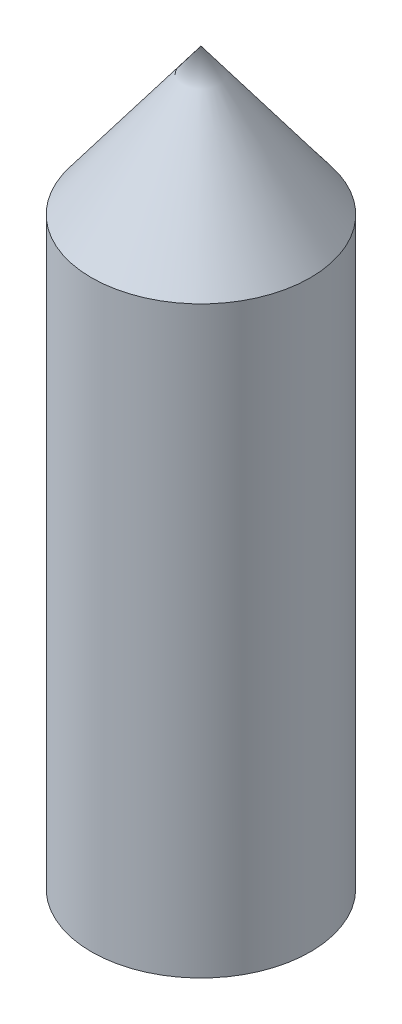
ISO-10303-21;
HEADER;
FILE_DESCRIPTION(('STEP AP214'),'2;1');
FILE_NAME('part.step','',(''),(''),'','','');
FILE_SCHEMA(('AUTOMOTIVE_DESIGN { 1 0 10303 214 1 1 1 1 }'));
ENDSEC;
DATA;
#1=APPLICATION_CONTEXT('core data for automotive mechanical design processes');
#2=APPLICATION_PROTOCOL_DEFINITION('international standard','automotive_design',2000,#1);
#3=PRODUCT_CONTEXT('',#1,'mechanical');
#4=PRODUCT('Part','Part','',(#3));
#5=PRODUCT_RELATED_PRODUCT_CATEGORY('part','',(#4));
#6=PRODUCT_DEFINITION_FORMATION('','',#4);
#7=PRODUCT_DEFINITION_CONTEXT('part definition',#1,'design');
#8=PRODUCT_DEFINITION('design','',#6,#7);
#9=PRODUCT_DEFINITION_SHAPE('','',#8);
#10=(LENGTH_UNIT() NAMED_UNIT(*) SI_UNIT(.MILLI.,.METRE.));
#11=(NAMED_UNIT(*) PLANE_ANGLE_UNIT() SI_UNIT($,.RADIAN.));
#12=(NAMED_UNIT(*) SI_UNIT($,.STERADIAN.) SOLID_ANGLE_UNIT());
#13=UNCERTAINTY_MEASURE_WITH_UNIT(LENGTH_MEASURE(1.E-05),#10,'distance_accuracy_value','');
#14=(GEOMETRIC_REPRESENTATION_CONTEXT(3) GLOBAL_UNCERTAINTY_ASSIGNED_CONTEXT((#13)) GLOBAL_UNIT_ASSIGNED_CONTEXT((#10,
#11,#12)) REPRESENTATION_CONTEXT('',''));
#15=CARTESIAN_POINT('',(0.,0.,0.));
#16=DIRECTION('',(0.,0.,1.));
#17=DIRECTION('',(1.,0.,0.));
#18=AXIS2_PLACEMENT_3D('',#15,#16,#17);
#19=CARTESIAN_POINT('',(0.,0.,0.));
#20=DIRECTION('',(0.,-1.,0.));
#21=DIRECTION('',(0.,0.,-1.));
#22=AXIS2_PLACEMENT_3D('',#19,#20,#21);
#23=PLANE('',#22);
#24=CARTESIAN_POINT('',(0.,0.,0.));
#25=DIRECTION('',(0.,1.,0.));
#26=DIRECTION('',(0.,0.,1.));
#27=AXIS2_PLACEMENT_3D('',#24,#25,#26);
#28=CIRCLE('',#27,7.5);
#29=CARTESIAN_POINT('',(0.,0.,7.5));
#30=VERTEX_POINT('',#29);
#31=EDGE_CURVE('E11',#30,#30,#28,.T.);
#32=ORIENTED_EDGE('',*,*,#31,.F.);
#33=EDGE_LOOP('',(#32));
#34=FACE_BOUND('',#33,.T.);
#35=ADVANCED_FACE('F33',(#34),#23,.T.);
#36=CARTESIAN_POINT('',(0.,50.,0.));
#37=DIRECTION('',(0.,1.,0.));
#38=DIRECTION('',(0.,0.,1.));
#39=AXIS2_PLACEMENT_3D('',#36,#37,#38);
#40=CYLINDRICAL_SURFACE('',#39,7.5);
#41=ORIENTED_EDGE('',*,*,#31,.T.);
#42=EDGE_LOOP('',(#41));
#43=FACE_BOUND('',#42,.T.);
#44=CARTESIAN_POINT('',(0.,40.,0.));
#45=DIRECTION('',(0.,1.,0.));
#46=DIRECTION('',(0.,0.,1.));
#47=AXIS2_PLACEMENT_3D('',#44,#45,#46);
#48=CIRCLE('',#47,7.5);
#49=CARTESIAN_POINT('',(0.,40.,7.5));
#50=VERTEX_POINT('',#49);
#51=EDGE_CURVE('E39',#50,#50,#48,.T.);
#52=ORIENTED_EDGE('',*,*,#51,.F.);
#53=EDGE_LOOP('',(#52));
#54=FACE_BOUND('',#53,.T.);
#55=ADVANCED_FACE('F44',(#43,#54),#40,.T.);
#56=CARTESIAN_POINT('',(0.,50.,0.));
#57=DIRECTION('',(0.,-1.,0.));
#58=DIRECTION('',(0.,0.,-1.));
#59=AXIS2_PLACEMENT_3D('',#56,#57,#58);
#60=CONICAL_SURFACE('',#59,0.,0.643501108793284);
#61=ORIENTED_EDGE('',*,*,#51,.T.);
#62=EDGE_LOOP('',(#61));
#63=FACE_BOUND('',#62,.T.);
#64=CARTESIAN_POINT('',(0.,50.,0.));
#65=VERTEX_POINT('',#64);
#66=VERTEX_LOOP('',#65);
#67=FACE_BOUND('',#66,.T.);
#68=ADVANCED_FACE('F42',(#63,#67),#60,.T.);
#69=CLOSED_SHELL('',(#35,#55,#68));
#70=MANIFOLD_SOLID_BREP('B2',#69);
#71=ADVANCED_BREP_SHAPE_REPRESENTATION('',(#18,#70),#14);
#72=SHAPE_DEFINITION_REPRESENTATION(#9,#71);
ENDSEC;
END-ISO-10303-21;
